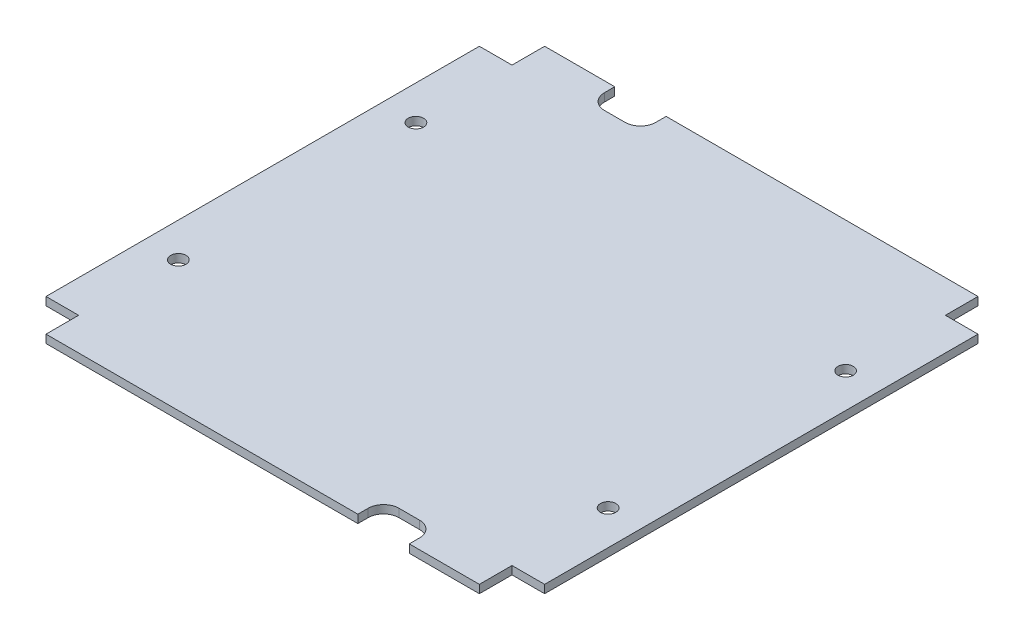
ISO-10303-21;
HEADER;
FILE_DESCRIPTION(('STEP AP214'),'2;1');
FILE_NAME('part.step','',(''),(''),'','','');
FILE_SCHEMA(('AUTOMOTIVE_DESIGN { 1 0 10303 214 1 1 1 1 }'));
ENDSEC;
DATA;
#1=APPLICATION_CONTEXT('core data for automotive mechanical design processes');
#2=APPLICATION_PROTOCOL_DEFINITION('international standard','automotive_design',2000,#1);
#3=PRODUCT_CONTEXT('',#1,'mechanical');
#4=PRODUCT('Part','Part','',(#3));
#5=PRODUCT_RELATED_PRODUCT_CATEGORY('part','',(#4));
#6=PRODUCT_DEFINITION_FORMATION('','',#4);
#7=PRODUCT_DEFINITION_CONTEXT('part definition',#1,'design');
#8=PRODUCT_DEFINITION('design','',#6,#7);
#9=PRODUCT_DEFINITION_SHAPE('','',#8);
#10=(LENGTH_UNIT() NAMED_UNIT(*) SI_UNIT(.MILLI.,.METRE.));
#11=(NAMED_UNIT(*) PLANE_ANGLE_UNIT() SI_UNIT($,.RADIAN.));
#12=(NAMED_UNIT(*) SI_UNIT($,.STERADIAN.) SOLID_ANGLE_UNIT());
#13=UNCERTAINTY_MEASURE_WITH_UNIT(LENGTH_MEASURE(1.E-05),#10,'distance_accuracy_value','');
#14=(GEOMETRIC_REPRESENTATION_CONTEXT(3) GLOBAL_UNCERTAINTY_ASSIGNED_CONTEXT((#13)) GLOBAL_UNIT_ASSIGNED_CONTEXT((#10,
#11,#12)) REPRESENTATION_CONTEXT('',''));
#15=CARTESIAN_POINT('',(0.,0.,0.));
#16=DIRECTION('',(0.,0.,1.));
#17=DIRECTION('',(1.,0.,0.));
#18=AXIS2_PLACEMENT_3D('',#15,#16,#17);
#19=CARTESIAN_POINT('',(61.8568578983799,34.525,-77.8015837190426));
#20=DIRECTION('',(0.,-1.,0.));
#21=DIRECTION('',(0.,0.,-1.));
#22=AXIS2_PLACEMENT_3D('',#19,#20,#21);
#23=PLANE('',#22);
#24=CARTESIAN_POINT('',(20.0443578983793,34.525,-100.914083719042));
#25=DIRECTION('',(0.,-1.,0.));
#26=DIRECTION('',(0.,0.,-1.));
#27=AXIS2_PLACEMENT_3D('',#24,#25,#26);
#28=CIRCLE('',#27,1.5);
#29=CARTESIAN_POINT('',(20.0443578983793,34.525,-102.414083719042));
#30=VERTEX_POINT('',#29);
#31=EDGE_CURVE('E167',#30,#30,#28,.F.);
#32=ORIENTED_EDGE('',*,*,#31,.T.);
#33=EDGE_LOOP('',(#32));
#34=FACE_BOUND('',#33,.T.);
#35=CARTESIAN_POINT('',(20.0443578983793,34.525,-54.6890837190416));
#36=DIRECTION('',(0.,-1.,0.));
#37=DIRECTION('',(0.,0.,-1.));
#38=AXIS2_PLACEMENT_3D('',#35,#36,#37);
#39=CIRCLE('',#38,1.5);
#40=CARTESIAN_POINT('',(20.0443578983793,34.525,-56.1890837190416));
#41=VERTEX_POINT('',#40);
#42=EDGE_CURVE('E170',#41,#41,#39,.F.);
#43=ORIENTED_EDGE('',*,*,#42,.T.);
#44=EDGE_LOOP('',(#43));
#45=FACE_BOUND('',#44,.T.);
#46=CARTESIAN_POINT('',(103.66935789838,34.525,-100.914083719043));
#47=DIRECTION('',(0.,-1.,0.));
#48=DIRECTION('',(0.,0.,-1.));
#49=AXIS2_PLACEMENT_3D('',#46,#47,#48);
#50=CIRCLE('',#49,1.5);
#51=CARTESIAN_POINT('',(103.66935789838,34.525,-102.414083719043));
#52=VERTEX_POINT('',#51);
#53=EDGE_CURVE('E446',#52,#52,#50,.F.);
#54=ORIENTED_EDGE('',*,*,#53,.T.);
#55=EDGE_LOOP('',(#54));
#56=FACE_BOUND('',#55,.T.);
#57=CARTESIAN_POINT('',(103.66935789838,34.525,-54.6890837190426));
#58=DIRECTION('',(0.,-1.,0.));
#59=DIRECTION('',(0.,0.,-1.));
#60=AXIS2_PLACEMENT_3D('',#57,#58,#59);
#61=CIRCLE('',#60,1.5);
#62=CARTESIAN_POINT('',(103.66935789838,34.525,-56.1890837190426));
#63=VERTEX_POINT('',#62);
#64=EDGE_CURVE('E179',#63,#63,#61,.F.);
#65=ORIENTED_EDGE('',*,*,#64,.T.);
#66=EDGE_LOOP('',(#65));
#67=FACE_BOUND('',#66,.T.);
#68=DIRECTION('',(0.,0.,1.));
#69=VECTOR('',#68,1.);
#70=CARTESIAN_POINT('',(19.6943578983799,34.525,-126.314083719043));
#71=LINE('',#70,#69);
#72=CARTESIAN_POINT('',(19.6943578983799,34.525,-126.314083719043));
#73=VERTEX_POINT('',#72);
#74=CARTESIAN_POINT('',(19.6943578983799,34.525,-119.964083719043));
#75=VERTEX_POINT('',#74);
#76=EDGE_CURVE('E349',#73,#75,#71,.T.);
#77=ORIENTED_EDGE('',*,*,#76,.F.);
#78=DIRECTION('',(-1.,0.,0.));
#79=VECTOR('',#78,1.);
#80=CARTESIAN_POINT('',(104.01935789838,34.525,-126.314083719043));
#81=LINE('',#80,#79);
#82=CARTESIAN_POINT('',(33.336683869696,34.525,-126.314083719043));
#83=VERTEX_POINT('',#82);
#84=EDGE_CURVE('E151',#83,#73,#81,.T.);
#85=ORIENTED_EDGE('',*,*,#84,.F.);
#86=DIRECTION('',(0.,0.,1.));
#87=VECTOR('',#86,1.);
#88=CARTESIAN_POINT('',(33.336683869696,34.525,-121.314083719043));
#89=LINE('',#88,#87);
#90=CARTESIAN_POINT('',(33.336683869696,34.525,-124.314083719043));
#91=VERTEX_POINT('',#90);
#92=EDGE_CURVE('E147',#83,#91,#89,.T.);
#93=ORIENTED_EDGE('',*,*,#92,.T.);
#94=CARTESIAN_POINT('',(36.336683869696,34.525,-124.314083719043));
#95=DIRECTION('',(0.,-1.,0.));
#96=DIRECTION('',(0.,0.,-1.));
#97=AXIS2_PLACEMENT_3D('',#94,#95,#96);
#98=CIRCLE('',#97,3.);
#99=CARTESIAN_POINT('',(36.336683869696,34.525,-121.314083719043));
#100=VERTEX_POINT('',#99);
#101=EDGE_CURVE('E180',#91,#100,#98,.F.);
#102=ORIENTED_EDGE('',*,*,#101,.T.);
#103=DIRECTION('',(1.,0.,0.));
#104=VECTOR('',#103,1.);
#105=CARTESIAN_POINT('',(43.336683869696,34.525,-121.314083719043));
#106=LINE('',#105,#104);
#107=CARTESIAN_POINT('',(40.336683869696,34.525,-121.314083719043));
#108=VERTEX_POINT('',#107);
#109=EDGE_CURVE('E185',#100,#108,#106,.T.);
#110=ORIENTED_EDGE('',*,*,#109,.T.);
#111=CARTESIAN_POINT('',(40.336683869696,34.525,-124.314083719043));
#112=DIRECTION('',(0.,-1.,0.));
#113=DIRECTION('',(0.,0.,-1.));
#114=AXIS2_PLACEMENT_3D('',#111,#112,#113);
#115=CIRCLE('',#114,3.);
#116=CARTESIAN_POINT('',(43.336683869696,34.525,-124.314083719043));
#117=VERTEX_POINT('',#116);
#118=EDGE_CURVE('E188',#108,#117,#115,.F.);
#119=ORIENTED_EDGE('',*,*,#118,.T.);
#120=DIRECTION('',(0.,0.,-1.));
#121=VECTOR('',#120,1.);
#122=CARTESIAN_POINT('',(43.336683869696,34.525,-126.314083719043));
#123=LINE('',#122,#121);
#124=CARTESIAN_POINT('',(43.336683869696,34.525,-126.314083719043));
#125=VERTEX_POINT('',#124);
#126=EDGE_CURVE('E192',#117,#125,#123,.T.);
#127=ORIENTED_EDGE('',*,*,#126,.T.);
#128=DIRECTION('',(-1.,0.,0.));
#129=VECTOR('',#128,1.);
#130=CARTESIAN_POINT('',(104.01935789838,34.525,-126.314083719043));
#131=LINE('',#130,#129);
#132=CARTESIAN_POINT('',(104.01935789838,34.525,-126.314083719043));
#133=VERTEX_POINT('',#132);
#134=EDGE_CURVE('E205',#133,#125,#131,.T.);
#135=ORIENTED_EDGE('',*,*,#134,.F.);
#136=DIRECTION('',(0.,0.,-1.));
#137=VECTOR('',#136,1.);
#138=CARTESIAN_POINT('',(104.01935789838,34.525,-119.964083719043));
#139=LINE('',#138,#137);
#140=CARTESIAN_POINT('',(104.01935789838,34.525,-119.964083719043));
#141=VERTEX_POINT('',#140);
#142=EDGE_CURVE('E216',#141,#133,#139,.T.);
#143=ORIENTED_EDGE('',*,*,#142,.F.);
#144=DIRECTION('',(-1.,0.,0.));
#145=VECTOR('',#144,1.);
#146=CARTESIAN_POINT('',(110.36935789838,34.525,-119.964083719043));
#147=LINE('',#146,#145);
#148=CARTESIAN_POINT('',(110.36935789838,34.525,-119.964083719043));
#149=VERTEX_POINT('',#148);
#150=EDGE_CURVE('E227',#149,#141,#147,.T.);
#151=ORIENTED_EDGE('',*,*,#150,.F.);
#152=DIRECTION('',(0.,0.,-1.));
#153=VECTOR('',#152,1.);
#154=CARTESIAN_POINT('',(110.36935789838,34.525,-35.6390837190426));
#155=LINE('',#154,#153);
#156=CARTESIAN_POINT('',(110.36935789838,34.525,-35.6390837190426));
#157=VERTEX_POINT('',#156);
#158=EDGE_CURVE('E238',#157,#149,#155,.T.);
#159=ORIENTED_EDGE('',*,*,#158,.F.);
#160=DIRECTION('',(1.,0.,0.));
#161=VECTOR('',#160,1.);
#162=CARTESIAN_POINT('',(104.01935789838,34.525,-35.6390837190426));
#163=LINE('',#162,#161);
#164=CARTESIAN_POINT('',(104.01935789838,34.525,-35.6390837190426));
#165=VERTEX_POINT('',#164);
#166=EDGE_CURVE('E249',#165,#157,#163,.T.);
#167=ORIENTED_EDGE('',*,*,#166,.F.);
#168=DIRECTION('',(0.,0.,-1.));
#169=VECTOR('',#168,1.);
#170=CARTESIAN_POINT('',(104.01935789838,34.525,-29.2890837190426));
#171=LINE('',#170,#169);
#172=CARTESIAN_POINT('',(104.01935789838,34.525,-29.2890837190426));
#173=VERTEX_POINT('',#172);
#174=EDGE_CURVE('E260',#173,#165,#171,.T.);
#175=ORIENTED_EDGE('',*,*,#174,.F.);
#176=DIRECTION('',(1.,0.,0.));
#177=VECTOR('',#176,1.);
#178=CARTESIAN_POINT('',(19.6943578983799,34.525,-29.2890837190426));
#179=LINE('',#178,#177);
#180=CARTESIAN_POINT('',(90.3770319270637,34.525,-29.2890837190426));
#181=VERTEX_POINT('',#180);
#182=EDGE_CURVE('E271',#181,#173,#179,.T.);
#183=ORIENTED_EDGE('',*,*,#182,.F.);
#184=DIRECTION('',(0.,0.,-1.));
#185=VECTOR('',#184,1.);
#186=CARTESIAN_POINT('',(90.3770319270637,34.525,-34.2890837190425));
#187=LINE('',#186,#185);
#188=CARTESIAN_POINT('',(90.3770319270637,34.525,-31.2890837190425));
#189=VERTEX_POINT('',#188);
#190=EDGE_CURVE('E276',#181,#189,#187,.T.);
#191=ORIENTED_EDGE('',*,*,#190,.T.);
#192=CARTESIAN_POINT('',(87.3770319270637,34.525,-31.2890837190425));
#193=DIRECTION('',(0.,-1.,0.));
#194=DIRECTION('',(0.,0.,-1.));
#195=AXIS2_PLACEMENT_3D('',#192,#193,#194);
#196=CIRCLE('',#195,3.);
#197=CARTESIAN_POINT('',(87.3770319270637,34.525,-34.2890837190425));
#198=VERTEX_POINT('',#197);
#199=EDGE_CURVE('E279',#189,#198,#196,.F.);
#200=ORIENTED_EDGE('',*,*,#199,.T.);
#201=DIRECTION('',(-1.,0.,0.));
#202=VECTOR('',#201,1.);
#203=CARTESIAN_POINT('',(80.3770319270637,34.525,-34.2890837190425));
#204=LINE('',#203,#202);
#205=CARTESIAN_POINT('',(83.3770319270637,34.525,-34.2890837190425));
#206=VERTEX_POINT('',#205);
#207=EDGE_CURVE('E89',#198,#206,#204,.T.);
#208=ORIENTED_EDGE('',*,*,#207,.T.);
#209=CARTESIAN_POINT('',(83.3770319270637,34.525,-31.2890837190425));
#210=DIRECTION('',(0.,-1.,0.));
#211=DIRECTION('',(0.,0.,-1.));
#212=AXIS2_PLACEMENT_3D('',#209,#210,#211);
#213=CIRCLE('',#212,3.);
#214=CARTESIAN_POINT('',(80.3770319270637,34.525,-31.2890837190425));
#215=VERTEX_POINT('',#214);
#216=EDGE_CURVE('E20',#206,#215,#213,.F.);
#217=ORIENTED_EDGE('',*,*,#216,.T.);
#218=DIRECTION('',(0.,0.,1.));
#219=VECTOR('',#218,1.);
#220=CARTESIAN_POINT('',(80.3770319270637,34.525,-29.2890837190425));
#221=LINE('',#220,#219);
#222=CARTESIAN_POINT('',(80.3770319270637,34.525,-29.2890837190426));
#223=VERTEX_POINT('',#222);
#224=EDGE_CURVE('E97',#215,#223,#221,.T.);
#225=ORIENTED_EDGE('',*,*,#224,.T.);
#226=DIRECTION('',(1.,0.,0.));
#227=VECTOR('',#226,1.);
#228=CARTESIAN_POINT('',(19.6943578983799,34.525,-29.2890837190426));
#229=LINE('',#228,#227);
#230=CARTESIAN_POINT('',(19.6943578983799,34.525,-29.2890837190426));
#231=VERTEX_POINT('',#230);
#232=EDGE_CURVE('E299',#231,#223,#229,.T.);
#233=ORIENTED_EDGE('',*,*,#232,.F.);
#234=DIRECTION('',(0.,0.,1.));
#235=VECTOR('',#234,1.);
#236=CARTESIAN_POINT('',(19.6943578983799,34.525,-35.6390837190426));
#237=LINE('',#236,#235);
#238=CARTESIAN_POINT('',(19.6943578983799,34.525,-35.6390837190426));
#239=VERTEX_POINT('',#238);
#240=EDGE_CURVE('E310',#239,#231,#237,.T.);
#241=ORIENTED_EDGE('',*,*,#240,.F.);
#242=DIRECTION('',(1.,0.,0.));
#243=VECTOR('',#242,1.);
#244=CARTESIAN_POINT('',(13.3443578983799,34.525,-35.6390837190426));
#245=LINE('',#244,#243);
#246=CARTESIAN_POINT('',(13.3443578983799,34.525,-35.6390837190426));
#247=VERTEX_POINT('',#246);
#248=EDGE_CURVE('E321',#247,#239,#245,.T.);
#249=ORIENTED_EDGE('',*,*,#248,.F.);
#250=DIRECTION('',(0.,0.,1.));
#251=VECTOR('',#250,1.);
#252=CARTESIAN_POINT('',(13.3443578983799,34.525,-119.964083719043));
#253=LINE('',#252,#251);
#254=CARTESIAN_POINT('',(13.3443578983799,34.525,-119.964083719043));
#255=VERTEX_POINT('',#254);
#256=EDGE_CURVE('E332',#255,#247,#253,.T.);
#257=ORIENTED_EDGE('',*,*,#256,.F.);
#258=DIRECTION('',(-1.,0.,0.));
#259=VECTOR('',#258,1.);
#260=CARTESIAN_POINT('',(19.6943578983799,34.525,-119.964083719043));
#261=LINE('',#260,#259);
#262=EDGE_CURVE('E342',#75,#255,#261,.T.);
#263=ORIENTED_EDGE('',*,*,#262,.F.);
#264=EDGE_LOOP('',(#77,#85,#93,#102,#110,#119,#127,#135,#143,#151,#159,#167,#175,#183,#191,#200,
#208,#217,#225,#233,#241,#249,#257,#263));
#265=FACE_BOUND('',#264,.T.);
#266=ADVANCED_FACE('F17',(#34,#45,#56,#67,#265),#23,.T.);
#267=CARTESIAN_POINT('',(33.336683869696,36.113,-121.314083719043));
#268=DIRECTION('',(-1.,0.,0.));
#269=DIRECTION('',(0.,0.,1.));
#270=AXIS2_PLACEMENT_3D('',#267,#268,#269);
#271=PLANE('',#270);
#272=ORIENTED_EDGE('',*,*,#92,.F.);
#273=DIRECTION('',(0.,1.,0.));
#274=VECTOR('',#273,1.);
#275=CARTESIAN_POINT('',(33.336683869696,34.525,-126.314083719043));
#276=LINE('',#275,#274);
#277=CARTESIAN_POINT('',(33.3366838696961,36.113,-126.314083719043));
#278=VERTEX_POINT('',#277);
#279=EDGE_CURVE('E140',#278,#83,#276,.F.);
#280=ORIENTED_EDGE('',*,*,#279,.F.);
#281=DIRECTION('',(0.,0.,1.));
#282=VECTOR('',#281,1.);
#283=CARTESIAN_POINT('',(33.3366838696961,36.113,-77.8015837190426));
#284=LINE('',#283,#282);
#285=CARTESIAN_POINT('',(33.3366838696961,36.113,-124.314083719043));
#286=VERTEX_POINT('',#285);
#287=EDGE_CURVE('E145',#286,#278,#284,.F.);
#288=ORIENTED_EDGE('',*,*,#287,.F.);
#289=DIRECTION('',(0.,-1.,0.));
#290=VECTOR('',#289,1.);
#291=CARTESIAN_POINT('',(33.336683869696,36.113,-124.314083719043));
#292=LINE('',#291,#290);
#293=EDGE_CURVE('E181',#286,#91,#292,.T.);
#294=ORIENTED_EDGE('',*,*,#293,.T.);
#295=EDGE_LOOP('',(#272,#280,#288,#294));
#296=FACE_BOUND('',#295,.T.);
#297=ADVANCED_FACE('F142',(#296),#271,.F.);
#298=CARTESIAN_POINT('',(104.01935789838,34.525,-126.314083719043));
#299=DIRECTION('',(0.,0.,-1.));
#300=DIRECTION('',(-1.,0.,0.));
#301=AXIS2_PLACEMENT_3D('',#298,#299,#300);
#302=PLANE('',#301);
#303=DIRECTION('',(0.,1.,0.));
#304=VECTOR('',#303,1.);
#305=CARTESIAN_POINT('',(19.6943578983799,34.525,-126.314083719043));
#306=LINE('',#305,#304);
#307=CARTESIAN_POINT('',(19.6943578983799,36.113,-126.314083719043));
#308=VERTEX_POINT('',#307);
#309=EDGE_CURVE('E157',#308,#73,#306,.F.);
#310=ORIENTED_EDGE('',*,*,#309,.F.);
#311=DIRECTION('',(1.,0.,0.));
#312=VECTOR('',#311,1.);
#313=CARTESIAN_POINT('',(61.8568578983799,36.113,-126.314083719043));
#314=LINE('',#313,#312);
#315=EDGE_CURVE('E154',#278,#308,#314,.F.);
#316=ORIENTED_EDGE('',*,*,#315,.F.);
#317=ORIENTED_EDGE('',*,*,#279,.T.);
#318=ORIENTED_EDGE('',*,*,#84,.T.);
#319=EDGE_LOOP('',(#310,#316,#317,#318));
#320=FACE_BOUND('',#319,.T.);
#321=ADVANCED_FACE('F155',(#320),#302,.T.);
#322=CARTESIAN_POINT('',(19.6943578983799,34.525,-126.314083719043));
#323=DIRECTION('',(-1.,0.,0.));
#324=DIRECTION('',(0.,0.,1.));
#325=AXIS2_PLACEMENT_3D('',#322,#323,#324);
#326=PLANE('',#325);
#327=DIRECTION('',(0.,0.,1.));
#328=VECTOR('',#327,1.);
#329=CARTESIAN_POINT('',(19.6943578983799,36.113,-77.8015837190426));
#330=LINE('',#329,#328);
#331=CARTESIAN_POINT('',(19.6943578983799,36.113,-119.964083719043));
#332=VERTEX_POINT('',#331);
#333=EDGE_CURVE('E161',#308,#332,#330,.T.);
#334=ORIENTED_EDGE('',*,*,#333,.F.);
#335=ORIENTED_EDGE('',*,*,#309,.T.);
#336=ORIENTED_EDGE('',*,*,#76,.T.);
#337=DIRECTION('',(0.,1.,0.));
#338=VECTOR('',#337,1.);
#339=CARTESIAN_POINT('',(19.6943578983799,34.525,-119.964083719043));
#340=LINE('',#339,#338);
#341=EDGE_CURVE('E339',#332,#75,#340,.F.);
#342=ORIENTED_EDGE('',*,*,#341,.F.);
#343=EDGE_LOOP('',(#334,#335,#336,#342));
#344=FACE_BOUND('',#343,.T.);
#345=ADVANCED_FACE('F494',(#344),#326,.T.);
#346=CARTESIAN_POINT('',(19.6943578983799,34.525,-119.964083719043));
#347=DIRECTION('',(0.,0.,-1.));
#348=DIRECTION('',(-1.,0.,0.));
#349=AXIS2_PLACEMENT_3D('',#346,#347,#348);
#350=PLANE('',#349);
#351=DIRECTION('',(1.,0.,0.));
#352=VECTOR('',#351,1.);
#353=CARTESIAN_POINT('',(61.8568578983799,36.113,-119.964083719043));
#354=LINE('',#353,#352);
#355=CARTESIAN_POINT('',(13.3443578983799,36.113,-119.964083719043));
#356=VERTEX_POINT('',#355);
#357=EDGE_CURVE('E326',#332,#356,#354,.F.);
#358=ORIENTED_EDGE('',*,*,#357,.F.);
#359=ORIENTED_EDGE('',*,*,#341,.T.);
#360=ORIENTED_EDGE('',*,*,#262,.T.);
#361=DIRECTION('',(0.,1.,0.));
#362=VECTOR('',#361,1.);
#363=CARTESIAN_POINT('',(13.3443578983799,34.525,-119.964083719043));
#364=LINE('',#363,#362);
#365=EDGE_CURVE('E329',#356,#255,#364,.F.);
#366=ORIENTED_EDGE('',*,*,#365,.F.);
#367=EDGE_LOOP('',(#358,#359,#360,#366));
#368=FACE_BOUND('',#367,.T.);
#369=ADVANCED_FACE('F492',(#368),#350,.T.);
#370=CARTESIAN_POINT('',(13.3443578983799,34.525,-119.964083719043));
#371=DIRECTION('',(-1.,0.,0.));
#372=DIRECTION('',(0.,0.,1.));
#373=AXIS2_PLACEMENT_3D('',#370,#371,#372);
#374=PLANE('',#373);
#375=DIRECTION('',(0.,0.,1.));
#376=VECTOR('',#375,1.);
#377=CARTESIAN_POINT('',(13.3443578983799,36.113,-77.8015837190426));
#378=LINE('',#377,#376);
#379=CARTESIAN_POINT('',(13.3443578983799,36.113,-35.6390837190426));
#380=VERTEX_POINT('',#379);
#381=EDGE_CURVE('E315',#356,#380,#378,.T.);
#382=ORIENTED_EDGE('',*,*,#381,.F.);
#383=ORIENTED_EDGE('',*,*,#365,.T.);
#384=ORIENTED_EDGE('',*,*,#256,.T.);
#385=DIRECTION('',(0.,1.,0.));
#386=VECTOR('',#385,1.);
#387=CARTESIAN_POINT('',(13.3443578983799,34.525,-35.6390837190426));
#388=LINE('',#387,#386);
#389=EDGE_CURVE('E318',#380,#247,#388,.F.);
#390=ORIENTED_EDGE('',*,*,#389,.F.);
#391=EDGE_LOOP('',(#382,#383,#384,#390));
#392=FACE_BOUND('',#391,.T.);
#393=ADVANCED_FACE('F490',(#392),#374,.T.);
#394=CARTESIAN_POINT('',(13.3443578983799,34.525,-35.6390837190426));
#395=DIRECTION('',(0.,0.,1.));
#396=DIRECTION('',(1.,0.,0.));
#397=AXIS2_PLACEMENT_3D('',#394,#395,#396);
#398=PLANE('',#397);
#399=DIRECTION('',(1.,0.,0.));
#400=VECTOR('',#399,1.);
#401=CARTESIAN_POINT('',(61.8568578983799,36.113,-35.6390837190426));
#402=LINE('',#401,#400);
#403=CARTESIAN_POINT('',(19.6943578983799,36.113,-35.6390837190426));
#404=VERTEX_POINT('',#403);
#405=EDGE_CURVE('E305',#380,#404,#402,.T.);
#406=ORIENTED_EDGE('',*,*,#405,.F.);
#407=ORIENTED_EDGE('',*,*,#389,.T.);
#408=ORIENTED_EDGE('',*,*,#248,.T.);
#409=DIRECTION('',(0.,1.,0.));
#410=VECTOR('',#409,1.);
#411=CARTESIAN_POINT('',(19.6943578983799,34.525,-35.6390837190426));
#412=LINE('',#411,#410);
#413=EDGE_CURVE('E300',#404,#239,#412,.F.);
#414=ORIENTED_EDGE('',*,*,#413,.F.);
#415=EDGE_LOOP('',(#406,#407,#408,#414));
#416=FACE_BOUND('',#415,.T.);
#417=ADVANCED_FACE('F484',(#416),#398,.T.);
#418=CARTESIAN_POINT('',(19.6943578983799,34.525,-35.6390837190426));
#419=DIRECTION('',(-1.,0.,0.));
#420=DIRECTION('',(0.,0.,1.));
#421=AXIS2_PLACEMENT_3D('',#418,#419,#420);
#422=PLANE('',#421);
#423=DIRECTION('',(0.,0.,1.));
#424=VECTOR('',#423,1.);
#425=CARTESIAN_POINT('',(19.6943578983799,36.113,-77.8015837190426));
#426=LINE('',#425,#424);
#427=CARTESIAN_POINT('',(19.6943578983799,36.113,-29.2890837190426));
#428=VERTEX_POINT('',#427);
#429=EDGE_CURVE('E293',#404,#428,#426,.T.);
#430=ORIENTED_EDGE('',*,*,#429,.F.);
#431=ORIENTED_EDGE('',*,*,#413,.T.);
#432=ORIENTED_EDGE('',*,*,#240,.T.);
#433=DIRECTION('',(0.,1.,0.));
#434=VECTOR('',#433,1.);
#435=CARTESIAN_POINT('',(19.6943578983799,34.525,-29.2890837190426));
#436=LINE('',#435,#434);
#437=EDGE_CURVE('E296',#428,#231,#436,.F.);
#438=ORIENTED_EDGE('',*,*,#437,.F.);
#439=EDGE_LOOP('',(#430,#431,#432,#438));
#440=FACE_BOUND('',#439,.T.);
#441=ADVANCED_FACE('F486',(#440),#422,.T.);
#442=CARTESIAN_POINT('',(19.6943578983799,34.525,-29.2890837190426));
#443=DIRECTION('',(0.,0.,1.));
#444=DIRECTION('',(1.,0.,0.));
#445=AXIS2_PLACEMENT_3D('',#442,#443,#444);
#446=PLANE('',#445);
#447=ORIENTED_EDGE('',*,*,#437,.T.);
#448=ORIENTED_EDGE('',*,*,#232,.T.);
#449=DIRECTION('',(0.,1.,0.));
#450=VECTOR('',#449,1.);
#451=CARTESIAN_POINT('',(80.3770319270637,36.113,-29.2890837190426));
#452=LINE('',#451,#450);
#453=CARTESIAN_POINT('',(80.3770319270637,36.113,-29.2890837190426));
#454=VERTEX_POINT('',#453);
#455=EDGE_CURVE('E284',#223,#454,#452,.T.);
#456=ORIENTED_EDGE('',*,*,#455,.T.);
#457=DIRECTION('',(1.,0.,0.));
#458=VECTOR('',#457,1.);
#459=CARTESIAN_POINT('',(61.8568578983799,36.113,-29.2890837190426));
#460=LINE('',#459,#458);
#461=EDGE_CURVE('E289',#428,#454,#460,.T.);
#462=ORIENTED_EDGE('',*,*,#461,.F.);
#463=EDGE_LOOP('',(#447,#448,#456,#462));
#464=FACE_BOUND('',#463,.T.);
#465=ADVANCED_FACE('F480',(#464),#446,.T.);
#466=CARTESIAN_POINT('',(80.3770319270637,36.113,-29.2890837190425));
#467=DIRECTION('',(-1.,0.,0.));
#468=DIRECTION('',(0.,0.,1.));
#469=AXIS2_PLACEMENT_3D('',#466,#467,#468);
#470=PLANE('',#469);
#471=DIRECTION('',(0.,0.,1.));
#472=VECTOR('',#471,1.);
#473=CARTESIAN_POINT('',(80.3770319270637,36.113,-77.8015837190426));
#474=LINE('',#473,#472);
#475=CARTESIAN_POINT('',(80.3770319270637,36.113,-31.2890837190425));
#476=VERTEX_POINT('',#475);
#477=EDGE_CURVE('E292',#454,#476,#474,.F.);
#478=ORIENTED_EDGE('',*,*,#477,.F.);
#479=ORIENTED_EDGE('',*,*,#455,.F.);
#480=ORIENTED_EDGE('',*,*,#224,.F.);
#481=DIRECTION('',(0.,-1.,0.));
#482=VECTOR('',#481,1.);
#483=CARTESIAN_POINT('',(80.3770319270637,36.113,-31.2890837190425));
#484=LINE('',#483,#482);
#485=EDGE_CURVE('E282',#215,#476,#484,.F.);
#486=ORIENTED_EDGE('',*,*,#485,.T.);
#487=EDGE_LOOP('',(#478,#479,#480,#486));
#488=FACE_BOUND('',#487,.T.);
#489=ADVANCED_FACE('F477',(#488),#470,.F.);
#490=CARTESIAN_POINT('',(83.3770319270637,36.113,-31.2890837190425));
#491=DIRECTION('',(0.,-1.,0.));
#492=DIRECTION('',(0.,0.,-1.));
#493=AXIS2_PLACEMENT_3D('',#490,#491,#492);
#494=CYLINDRICAL_SURFACE('',#493,3.);
#495=ORIENTED_EDGE('',*,*,#485,.F.);
#496=ORIENTED_EDGE('',*,*,#216,.F.);
#497=DIRECTION('',(0.,1.,0.));
#498=VECTOR('',#497,1.);
#499=CARTESIAN_POINT('',(83.3770319270637,36.113,-34.2890837190425));
#500=LINE('',#499,#498);
#501=CARTESIAN_POINT('',(83.3770319270637,36.113,-34.2890837190426));
#502=VERTEX_POINT('',#501);
#503=EDGE_CURVE('E280',#206,#502,#500,.T.);
#504=ORIENTED_EDGE('',*,*,#503,.T.);
#505=CARTESIAN_POINT('',(83.3770319270637,36.113,-31.2890837190425));
#506=DIRECTION('',(0.,-1.,0.));
#507=DIRECTION('',(0.,0.,-1.));
#508=AXIS2_PLACEMENT_3D('',#505,#506,#507);
#509=CIRCLE('',#508,3.);
#510=EDGE_CURVE('E441',#476,#502,#509,.T.);
#511=ORIENTED_EDGE('',*,*,#510,.F.);
#512=EDGE_LOOP('',(#495,#496,#504,#511));
#513=FACE_BOUND('',#512,.T.);
#514=ADVANCED_FACE('F647',(#513),#494,.F.);
#515=CARTESIAN_POINT('',(80.3770319270637,36.113,-34.2890837190425));
#516=DIRECTION('',(0.,0.,-1.));
#517=DIRECTION('',(-1.,0.,0.));
#518=AXIS2_PLACEMENT_3D('',#515,#516,#517);
#519=PLANE('',#518);
#520=DIRECTION('',(1.,0.,0.));
#521=VECTOR('',#520,1.);
#522=CARTESIAN_POINT('',(61.8568578983799,36.113,-34.2890837190426));
#523=LINE('',#522,#521);
#524=CARTESIAN_POINT('',(87.3770319270637,36.113,-34.2890837190426));
#525=VERTEX_POINT('',#524);
#526=EDGE_CURVE('E440',#502,#525,#523,.T.);
#527=ORIENTED_EDGE('',*,*,#526,.F.);
#528=ORIENTED_EDGE('',*,*,#503,.F.);
#529=ORIENTED_EDGE('',*,*,#207,.F.);
#530=DIRECTION('',(0.,-1.,0.));
#531=VECTOR('',#530,1.);
#532=CARTESIAN_POINT('',(87.3770319270637,36.113,-34.2890837190425));
#533=LINE('',#532,#531);
#534=EDGE_CURVE('E277',#198,#525,#533,.F.);
#535=ORIENTED_EDGE('',*,*,#534,.T.);
#536=EDGE_LOOP('',(#527,#528,#529,#535));
#537=FACE_BOUND('',#536,.T.);
#538=ADVANCED_FACE('F461',(#537),#519,.F.);
#539=CARTESIAN_POINT('',(87.3770319270637,36.113,-31.2890837190425));
#540=DIRECTION('',(0.,-1.,0.));
#541=DIRECTION('',(0.,0.,-1.));
#542=AXIS2_PLACEMENT_3D('',#539,#540,#541);
#543=CYLINDRICAL_SURFACE('',#542,3.);
#544=ORIENTED_EDGE('',*,*,#534,.F.);
#545=ORIENTED_EDGE('',*,*,#199,.F.);
#546=DIRECTION('',(0.,1.,0.));
#547=VECTOR('',#546,1.);
#548=CARTESIAN_POINT('',(90.3770319270637,36.113,-31.2890837190425));
#549=LINE('',#548,#547);
#550=CARTESIAN_POINT('',(90.3770319270637,36.113,-31.2890837190425));
#551=VERTEX_POINT('',#550);
#552=EDGE_CURVE('E272',#189,#551,#549,.T.);
#553=ORIENTED_EDGE('',*,*,#552,.T.);
#554=CARTESIAN_POINT('',(87.3770319270637,36.113,-31.2890837190425));
#555=DIRECTION('',(0.,-1.,0.));
#556=DIRECTION('',(0.,0.,-1.));
#557=AXIS2_PLACEMENT_3D('',#554,#555,#556);
#558=CIRCLE('',#557,3.);
#559=EDGE_CURVE('E437',#525,#551,#558,.T.);
#560=ORIENTED_EDGE('',*,*,#559,.F.);
#561=EDGE_LOOP('',(#544,#545,#553,#560));
#562=FACE_BOUND('',#561,.T.);
#563=ADVANCED_FACE('F463',(#562),#543,.F.);
#564=CARTESIAN_POINT('',(90.3770319270637,36.113,-34.2890837190425));
#565=DIRECTION('',(1.,0.,0.));
#566=DIRECTION('',(0.,0.,-1.));
#567=AXIS2_PLACEMENT_3D('',#564,#565,#566);
#568=PLANE('',#567);
#569=ORIENTED_EDGE('',*,*,#190,.F.);
#570=DIRECTION('',(0.,1.,0.));
#571=VECTOR('',#570,1.);
#572=CARTESIAN_POINT('',(90.3770319270637,34.525,-29.2890837190426));
#573=LINE('',#572,#571);
#574=CARTESIAN_POINT('',(90.3770319270637,36.113,-29.2890837190425));
#575=VERTEX_POINT('',#574);
#576=EDGE_CURVE('E268',#575,#181,#573,.F.);
#577=ORIENTED_EDGE('',*,*,#576,.F.);
#578=DIRECTION('',(0.,0.,1.));
#579=VECTOR('',#578,1.);
#580=CARTESIAN_POINT('',(90.3770319270637,36.113,-77.8015837190426));
#581=LINE('',#580,#579);
#582=EDGE_CURVE('E265',#551,#575,#581,.T.);
#583=ORIENTED_EDGE('',*,*,#582,.F.);
#584=ORIENTED_EDGE('',*,*,#552,.F.);
#585=EDGE_LOOP('',(#569,#577,#583,#584));
#586=FACE_BOUND('',#585,.T.);
#587=ADVANCED_FACE('F510',(#586),#568,.F.);
#588=CARTESIAN_POINT('',(19.6943578983799,34.525,-29.2890837190426));
#589=DIRECTION('',(0.,0.,1.));
#590=DIRECTION('',(1.,0.,0.));
#591=AXIS2_PLACEMENT_3D('',#588,#589,#590);
#592=PLANE('',#591);
#593=DIRECTION('',(0.,1.,0.));
#594=VECTOR('',#593,1.);
#595=CARTESIAN_POINT('',(104.01935789838,34.525,-29.2890837190426));
#596=LINE('',#595,#594);
#597=CARTESIAN_POINT('',(104.01935789838,36.113,-29.2890837190425));
#598=VERTEX_POINT('',#597);
#599=EDGE_CURVE('E257',#598,#173,#596,.F.);
#600=ORIENTED_EDGE('',*,*,#599,.F.);
#601=DIRECTION('',(1.,0.,0.));
#602=VECTOR('',#601,1.);
#603=CARTESIAN_POINT('',(61.8568578983799,36.113,-29.2890837190425));
#604=LINE('',#603,#602);
#605=EDGE_CURVE('E254',#575,#598,#604,.T.);
#606=ORIENTED_EDGE('',*,*,#605,.F.);
#607=ORIENTED_EDGE('',*,*,#576,.T.);
#608=ORIENTED_EDGE('',*,*,#182,.T.);
#609=EDGE_LOOP('',(#600,#606,#607,#608));
#610=FACE_BOUND('',#609,.T.);
#611=ADVANCED_FACE('F513',(#610),#592,.T.);
#612=CARTESIAN_POINT('',(104.01935789838,34.525,-29.2890837190426));
#613=DIRECTION('',(1.,0.,0.));
#614=DIRECTION('',(0.,0.,-1.));
#615=AXIS2_PLACEMENT_3D('',#612,#613,#614);
#616=PLANE('',#615);
#617=DIRECTION('',(0.,0.,1.));
#618=VECTOR('',#617,1.);
#619=CARTESIAN_POINT('',(104.01935789838,36.113,-77.8015837190426));
#620=LINE('',#619,#618);
#621=CARTESIAN_POINT('',(104.01935789838,36.113,-35.6390837190426));
#622=VERTEX_POINT('',#621);
#623=EDGE_CURVE('E243',#598,#622,#620,.F.);
#624=ORIENTED_EDGE('',*,*,#623,.F.);
#625=ORIENTED_EDGE('',*,*,#599,.T.);
#626=ORIENTED_EDGE('',*,*,#174,.T.);
#627=DIRECTION('',(0.,1.,0.));
#628=VECTOR('',#627,1.);
#629=CARTESIAN_POINT('',(104.01935789838,34.525,-35.6390837190426));
#630=LINE('',#629,#628);
#631=EDGE_CURVE('E246',#622,#165,#630,.F.);
#632=ORIENTED_EDGE('',*,*,#631,.F.);
#633=EDGE_LOOP('',(#624,#625,#626,#632));
#634=FACE_BOUND('',#633,.T.);
#635=ADVANCED_FACE('F520',(#634),#616,.T.);
#636=CARTESIAN_POINT('',(104.01935789838,34.525,-35.6390837190426));
#637=DIRECTION('',(0.,0.,1.));
#638=DIRECTION('',(1.,0.,0.));
#639=AXIS2_PLACEMENT_3D('',#636,#637,#638);
#640=PLANE('',#639);
#641=DIRECTION('',(1.,0.,0.));
#642=VECTOR('',#641,1.);
#643=CARTESIAN_POINT('',(61.8568578983799,36.113,-35.6390837190426));
#644=LINE('',#643,#642);
#645=CARTESIAN_POINT('',(110.36935789838,36.113,-35.6390837190426));
#646=VERTEX_POINT('',#645);
#647=EDGE_CURVE('E232',#622,#646,#644,.T.);
#648=ORIENTED_EDGE('',*,*,#647,.F.);
#649=ORIENTED_EDGE('',*,*,#631,.T.);
#650=ORIENTED_EDGE('',*,*,#166,.T.);
#651=DIRECTION('',(0.,1.,0.));
#652=VECTOR('',#651,1.);
#653=CARTESIAN_POINT('',(110.36935789838,34.525,-35.6390837190426));
#654=LINE('',#653,#652);
#655=EDGE_CURVE('E235',#646,#157,#654,.F.);
#656=ORIENTED_EDGE('',*,*,#655,.F.);
#657=EDGE_LOOP('',(#648,#649,#650,#656));
#658=FACE_BOUND('',#657,.T.);
#659=ADVANCED_FACE('F538',(#658),#640,.T.);
#660=CARTESIAN_POINT('',(110.36935789838,34.525,-35.6390837190426));
#661=DIRECTION('',(1.,0.,0.));
#662=DIRECTION('',(0.,0.,-1.));
#663=AXIS2_PLACEMENT_3D('',#660,#661,#662);
#664=PLANE('',#663);
#665=DIRECTION('',(0.,0.,1.));
#666=VECTOR('',#665,1.);
#667=CARTESIAN_POINT('',(110.36935789838,36.113,-77.8015837190426));
#668=LINE('',#667,#666);
#669=CARTESIAN_POINT('',(110.36935789838,36.113,-119.964083719043));
#670=VERTEX_POINT('',#669);
#671=EDGE_CURVE('E221',#646,#670,#668,.F.);
#672=ORIENTED_EDGE('',*,*,#671,.F.);
#673=ORIENTED_EDGE('',*,*,#655,.T.);
#674=ORIENTED_EDGE('',*,*,#158,.T.);
#675=DIRECTION('',(0.,1.,0.));
#676=VECTOR('',#675,1.);
#677=CARTESIAN_POINT('',(110.36935789838,34.525,-119.964083719043));
#678=LINE('',#677,#676);
#679=EDGE_CURVE('E224',#670,#149,#678,.F.);
#680=ORIENTED_EDGE('',*,*,#679,.F.);
#681=EDGE_LOOP('',(#672,#673,#674,#680));
#682=FACE_BOUND('',#681,.T.);
#683=ADVANCED_FACE('F542',(#682),#664,.T.);
#684=CARTESIAN_POINT('',(110.36935789838,34.525,-119.964083719043));
#685=DIRECTION('',(0.,0.,-1.));
#686=DIRECTION('',(-1.,0.,0.));
#687=AXIS2_PLACEMENT_3D('',#684,#685,#686);
#688=PLANE('',#687);
#689=DIRECTION('',(1.,0.,0.));
#690=VECTOR('',#689,1.);
#691=CARTESIAN_POINT('',(61.8568578983799,36.113,-119.964083719043));
#692=LINE('',#691,#690);
#693=CARTESIAN_POINT('',(104.01935789838,36.113,-119.964083719043));
#694=VERTEX_POINT('',#693);
#695=EDGE_CURVE('E211',#670,#694,#692,.F.);
#696=ORIENTED_EDGE('',*,*,#695,.F.);
#697=ORIENTED_EDGE('',*,*,#679,.T.);
#698=ORIENTED_EDGE('',*,*,#150,.T.);
#699=DIRECTION('',(0.,1.,0.));
#700=VECTOR('',#699,1.);
#701=CARTESIAN_POINT('',(104.01935789838,34.525,-119.964083719043));
#702=LINE('',#701,#700);
#703=EDGE_CURVE('E206',#694,#141,#702,.F.);
#704=ORIENTED_EDGE('',*,*,#703,.F.);
#705=EDGE_LOOP('',(#696,#697,#698,#704));
#706=FACE_BOUND('',#705,.T.);
#707=ADVANCED_FACE('F557',(#706),#688,.T.);
#708=CARTESIAN_POINT('',(104.01935789838,34.525,-119.964083719043));
#709=DIRECTION('',(1.,0.,0.));
#710=DIRECTION('',(0.,0.,-1.));
#711=AXIS2_PLACEMENT_3D('',#708,#709,#710);
#712=PLANE('',#711);
#713=DIRECTION('',(0.,0.,1.));
#714=VECTOR('',#713,1.);
#715=CARTESIAN_POINT('',(104.01935789838,36.113,-77.8015837190426));
#716=LINE('',#715,#714);
#717=CARTESIAN_POINT('',(104.01935789838,36.113,-126.314083719043));
#718=VERTEX_POINT('',#717);
#719=EDGE_CURVE('E199',#694,#718,#716,.F.);
#720=ORIENTED_EDGE('',*,*,#719,.F.);
#721=ORIENTED_EDGE('',*,*,#703,.T.);
#722=ORIENTED_EDGE('',*,*,#142,.T.);
#723=DIRECTION('',(0.,1.,0.));
#724=VECTOR('',#723,1.);
#725=CARTESIAN_POINT('',(104.01935789838,34.525,-126.314083719043));
#726=LINE('',#725,#724);
#727=EDGE_CURVE('E202',#718,#133,#726,.F.);
#728=ORIENTED_EDGE('',*,*,#727,.F.);
#729=EDGE_LOOP('',(#720,#721,#722,#728));
#730=FACE_BOUND('',#729,.T.);
#731=ADVANCED_FACE('F561',(#730),#712,.T.);
#732=CARTESIAN_POINT('',(104.01935789838,34.525,-126.314083719043));
#733=DIRECTION('',(0.,0.,-1.));
#734=DIRECTION('',(-1.,0.,0.));
#735=AXIS2_PLACEMENT_3D('',#732,#733,#734);
#736=PLANE('',#735);
#737=ORIENTED_EDGE('',*,*,#727,.T.);
#738=ORIENTED_EDGE('',*,*,#134,.T.);
#739=DIRECTION('',(0.,1.,0.));
#740=VECTOR('',#739,1.);
#741=CARTESIAN_POINT('',(43.336683869696,36.113,-126.314083719043));
#742=LINE('',#741,#740);
#743=CARTESIAN_POINT('',(43.336683869696,36.113,-126.314083719043));
#744=VERTEX_POINT('',#743);
#745=EDGE_CURVE('E189',#125,#744,#742,.T.);
#746=ORIENTED_EDGE('',*,*,#745,.T.);
#747=DIRECTION('',(1.,0.,0.));
#748=VECTOR('',#747,1.);
#749=CARTESIAN_POINT('',(61.8568578983799,36.113,-126.314083719043));
#750=LINE('',#749,#748);
#751=EDGE_CURVE('E195',#718,#744,#750,.F.);
#752=ORIENTED_EDGE('',*,*,#751,.F.);
#753=EDGE_LOOP('',(#737,#738,#746,#752));
#754=FACE_BOUND('',#753,.T.);
#755=ADVANCED_FACE('F572',(#754),#736,.T.);
#756=CARTESIAN_POINT('',(43.336683869696,36.113,-126.314083719043));
#757=DIRECTION('',(1.,0.,0.));
#758=DIRECTION('',(0.,0.,-1.));
#759=AXIS2_PLACEMENT_3D('',#756,#757,#758);
#760=PLANE('',#759);
#761=DIRECTION('',(0.,0.,1.));
#762=VECTOR('',#761,1.);
#763=CARTESIAN_POINT('',(43.336683869696,36.113,-77.8015837190426));
#764=LINE('',#763,#762);
#765=CARTESIAN_POINT('',(43.336683869696,36.113,-124.314083719043));
#766=VERTEX_POINT('',#765);
#767=EDGE_CURVE('E198',#744,#766,#764,.T.);
#768=ORIENTED_EDGE('',*,*,#767,.F.);
#769=ORIENTED_EDGE('',*,*,#745,.F.);
#770=ORIENTED_EDGE('',*,*,#126,.F.);
#771=DIRECTION('',(0.,-1.,0.));
#772=VECTOR('',#771,1.);
#773=CARTESIAN_POINT('',(43.336683869696,36.113,-124.314083719043));
#774=LINE('',#773,#772);
#775=EDGE_CURVE('E186',#117,#766,#774,.F.);
#776=ORIENTED_EDGE('',*,*,#775,.T.);
#777=EDGE_LOOP('',(#768,#769,#770,#776));
#778=FACE_BOUND('',#777,.T.);
#779=ADVANCED_FACE('F574',(#778),#760,.F.);
#780=CARTESIAN_POINT('',(40.336683869696,36.113,-124.314083719043));
#781=DIRECTION('',(0.,-1.,0.));
#782=DIRECTION('',(0.,0.,-1.));
#783=AXIS2_PLACEMENT_3D('',#780,#781,#782);
#784=CYLINDRICAL_SURFACE('',#783,3.);
#785=ORIENTED_EDGE('',*,*,#775,.F.);
#786=ORIENTED_EDGE('',*,*,#118,.F.);
#787=DIRECTION('',(0.,1.,0.));
#788=VECTOR('',#787,1.);
#789=CARTESIAN_POINT('',(40.336683869696,36.113,-121.314083719043));
#790=LINE('',#789,#788);
#791=CARTESIAN_POINT('',(40.336683869696,36.113,-121.314083719043));
#792=VERTEX_POINT('',#791);
#793=EDGE_CURVE('E183',#108,#792,#790,.T.);
#794=ORIENTED_EDGE('',*,*,#793,.T.);
#795=CARTESIAN_POINT('',(40.336683869696,36.113,-124.314083719043));
#796=DIRECTION('',(0.,-1.,0.));
#797=DIRECTION('',(0.,0.,-1.));
#798=AXIS2_PLACEMENT_3D('',#795,#796,#797);
#799=CIRCLE('',#798,3.);
#800=EDGE_CURVE('E434',#766,#792,#799,.T.);
#801=ORIENTED_EDGE('',*,*,#800,.F.);
#802=EDGE_LOOP('',(#785,#786,#794,#801));
#803=FACE_BOUND('',#802,.T.);
#804=ADVANCED_FACE('F576',(#803),#784,.F.);
#805=CARTESIAN_POINT('',(43.336683869696,36.113,-121.314083719043));
#806=DIRECTION('',(0.,0.,1.));
#807=DIRECTION('',(1.,0.,0.));
#808=AXIS2_PLACEMENT_3D('',#805,#806,#807);
#809=PLANE('',#808);
#810=ORIENTED_EDGE('',*,*,#109,.F.);
#811=DIRECTION('',(0.,-1.,0.));
#812=VECTOR('',#811,1.);
#813=CARTESIAN_POINT('',(36.336683869696,36.113,-121.314083719043));
#814=LINE('',#813,#812);
#815=CARTESIAN_POINT('',(36.336683869696,36.113,-121.314083719043));
#816=VERTEX_POINT('',#815);
#817=EDGE_CURVE('E35',#100,#816,#814,.F.);
#818=ORIENTED_EDGE('',*,*,#817,.T.);
#819=DIRECTION('',(1.,0.,0.));
#820=VECTOR('',#819,1.);
#821=CARTESIAN_POINT('',(61.8568578983799,36.113,-121.314083719043));
#822=LINE('',#821,#820);
#823=EDGE_CURVE('E433',#792,#816,#822,.F.);
#824=ORIENTED_EDGE('',*,*,#823,.F.);
#825=ORIENTED_EDGE('',*,*,#793,.F.);
#826=EDGE_LOOP('',(#810,#818,#824,#825));
#827=FACE_BOUND('',#826,.T.);
#828=ADVANCED_FACE('F577',(#827),#809,.F.);
#829=CARTESIAN_POINT('',(36.336683869696,36.113,-124.314083719043));
#830=DIRECTION('',(0.,-1.,0.));
#831=DIRECTION('',(0.,0.,-1.));
#832=AXIS2_PLACEMENT_3D('',#829,#830,#831);
#833=CYLINDRICAL_SURFACE('',#832,3.);
#834=ORIENTED_EDGE('',*,*,#817,.F.);
#835=ORIENTED_EDGE('',*,*,#101,.F.);
#836=ORIENTED_EDGE('',*,*,#293,.F.);
#837=CARTESIAN_POINT('',(36.336683869696,36.113,-124.314083719043));
#838=DIRECTION('',(0.,-1.,0.));
#839=DIRECTION('',(0.,0.,-1.));
#840=AXIS2_PLACEMENT_3D('',#837,#838,#839);
#841=CIRCLE('',#840,3.);
#842=EDGE_CURVE('E166',#816,#286,#841,.T.);
#843=ORIENTED_EDGE('',*,*,#842,.F.);
#844=EDGE_LOOP('',(#834,#835,#836,#843));
#845=FACE_BOUND('',#844,.T.);
#846=ADVANCED_FACE('F497',(#845),#833,.F.);
#847=CARTESIAN_POINT('',(103.66935789838,36.113,-54.6890837190426));
#848=DIRECTION('',(0.,-1.,0.));
#849=DIRECTION('',(0.,0.,-1.));
#850=AXIS2_PLACEMENT_3D('',#847,#848,#849);
#851=CYLINDRICAL_SURFACE('',#850,1.5);
#852=CARTESIAN_POINT('',(103.66935789838,36.113,-54.6890837190426));
#853=DIRECTION('',(0.,-1.,0.));
#854=DIRECTION('',(0.,0.,-1.));
#855=AXIS2_PLACEMENT_3D('',#852,#853,#854);
#856=CIRCLE('',#855,1.5);
#857=CARTESIAN_POINT('',(103.66935789838,36.113,-56.1890837190426));
#858=VERTEX_POINT('',#857);
#859=EDGE_CURVE('E429',#858,#858,#856,.T.);
#860=ORIENTED_EDGE('',*,*,#859,.F.);
#861=EDGE_LOOP('',(#860));
#862=FACE_BOUND('',#861,.T.);
#863=ORIENTED_EDGE('',*,*,#64,.F.);
#864=EDGE_LOOP('',(#863));
#865=FACE_BOUND('',#864,.T.);
#866=ADVANCED_FACE('F585',(#862,#865),#851,.F.);
#867=CARTESIAN_POINT('',(103.66935789838,36.113,-100.914083719043));
#868=DIRECTION('',(0.,-1.,0.));
#869=DIRECTION('',(0.,0.,-1.));
#870=AXIS2_PLACEMENT_3D('',#867,#868,#869);
#871=CYLINDRICAL_SURFACE('',#870,1.5);
#872=CARTESIAN_POINT('',(103.66935789838,36.113,-100.914083719043));
#873=DIRECTION('',(0.,-1.,0.));
#874=DIRECTION('',(0.,0.,-1.));
#875=AXIS2_PLACEMENT_3D('',#872,#873,#874);
#876=CIRCLE('',#875,1.5);
#877=CARTESIAN_POINT('',(103.66935789838,36.113,-102.414083719043));
#878=VERTEX_POINT('',#877);
#879=EDGE_CURVE('E426',#878,#878,#876,.T.);
#880=ORIENTED_EDGE('',*,*,#879,.F.);
#881=EDGE_LOOP('',(#880));
#882=FACE_BOUND('',#881,.T.);
#883=ORIENTED_EDGE('',*,*,#53,.F.);
#884=EDGE_LOOP('',(#883));
#885=FACE_BOUND('',#884,.T.);
#886=ADVANCED_FACE('F602',(#882,#885),#871,.F.);
#887=CARTESIAN_POINT('',(20.0443578983793,37.7010000000001,-54.6890837190416));
#888=DIRECTION('',(0.,-1.,0.));
#889=DIRECTION('',(0.,0.,-1.));
#890=AXIS2_PLACEMENT_3D('',#887,#888,#889);
#891=CYLINDRICAL_SURFACE('',#890,1.5);
#892=CARTESIAN_POINT('',(20.0443578983793,36.113,-54.6890837190416));
#893=DIRECTION('',(0.,-1.,0.));
#894=DIRECTION('',(0.,0.,-1.));
#895=AXIS2_PLACEMENT_3D('',#892,#893,#894);
#896=CIRCLE('',#895,1.5);
#897=CARTESIAN_POINT('',(20.0443578983793,36.113,-56.1890837190416));
#898=VERTEX_POINT('',#897);
#899=EDGE_CURVE('E26',#898,#898,#896,.T.);
#900=ORIENTED_EDGE('',*,*,#899,.F.);
#901=EDGE_LOOP('',(#900));
#902=FACE_BOUND('',#901,.T.);
#903=ORIENTED_EDGE('',*,*,#42,.F.);
#904=EDGE_LOOP('',(#903));
#905=FACE_BOUND('',#904,.T.);
#906=ADVANCED_FACE('F595',(#902,#905),#891,.F.);
#907=CARTESIAN_POINT('',(20.0443578983793,37.7010000000001,-100.914083719042));
#908=DIRECTION('',(0.,-1.,0.));
#909=DIRECTION('',(0.,0.,-1.));
#910=AXIS2_PLACEMENT_3D('',#907,#908,#909);
#911=CYLINDRICAL_SURFACE('',#910,1.5);
#912=CARTESIAN_POINT('',(20.0443578983793,36.113,-100.914083719042));
#913=DIRECTION('',(0.,-1.,0.));
#914=DIRECTION('',(0.,0.,-1.));
#915=AXIS2_PLACEMENT_3D('',#912,#913,#914);
#916=CIRCLE('',#915,1.5);
#917=CARTESIAN_POINT('',(20.0443578983793,36.113,-102.414083719042));
#918=VERTEX_POINT('',#917);
#919=EDGE_CURVE('E11',#918,#918,#916,.T.);
#920=ORIENTED_EDGE('',*,*,#919,.F.);
#921=EDGE_LOOP('',(#920));
#922=FACE_BOUND('',#921,.T.);
#923=ORIENTED_EDGE('',*,*,#31,.F.);
#924=EDGE_LOOP('',(#923));
#925=FACE_BOUND('',#924,.T.);
#926=ADVANCED_FACE('F589',(#922,#925),#911,.F.);
#927=CARTESIAN_POINT('',(61.8568578983799,36.113,-77.8015837190426));
#928=DIRECTION('',(0.,1.,0.));
#929=DIRECTION('',(0.,0.,1.));
#930=AXIS2_PLACEMENT_3D('',#927,#928,#929);
#931=PLANE('',#930);
#932=ORIENTED_EDGE('',*,*,#919,.T.);
#933=EDGE_LOOP('',(#932));
#934=FACE_BOUND('',#933,.T.);
#935=ORIENTED_EDGE('',*,*,#899,.T.);
#936=EDGE_LOOP('',(#935));
#937=FACE_BOUND('',#936,.T.);
#938=ORIENTED_EDGE('',*,*,#879,.T.);
#939=EDGE_LOOP('',(#938));
#940=FACE_BOUND('',#939,.T.);
#941=ORIENTED_EDGE('',*,*,#859,.T.);
#942=EDGE_LOOP('',(#941));
#943=FACE_BOUND('',#942,.T.);
#944=ORIENTED_EDGE('',*,*,#823,.T.);
#945=ORIENTED_EDGE('',*,*,#842,.T.);
#946=ORIENTED_EDGE('',*,*,#287,.T.);
#947=ORIENTED_EDGE('',*,*,#315,.T.);
#948=ORIENTED_EDGE('',*,*,#333,.T.);
#949=ORIENTED_EDGE('',*,*,#357,.T.);
#950=ORIENTED_EDGE('',*,*,#381,.T.);
#951=ORIENTED_EDGE('',*,*,#405,.T.);
#952=ORIENTED_EDGE('',*,*,#429,.T.);
#953=ORIENTED_EDGE('',*,*,#461,.T.);
#954=ORIENTED_EDGE('',*,*,#477,.T.);
#955=ORIENTED_EDGE('',*,*,#510,.T.);
#956=ORIENTED_EDGE('',*,*,#526,.T.);
#957=ORIENTED_EDGE('',*,*,#559,.T.);
#958=ORIENTED_EDGE('',*,*,#582,.T.);
#959=ORIENTED_EDGE('',*,*,#605,.T.);
#960=ORIENTED_EDGE('',*,*,#623,.T.);
#961=ORIENTED_EDGE('',*,*,#647,.T.);
#962=ORIENTED_EDGE('',*,*,#671,.T.);
#963=ORIENTED_EDGE('',*,*,#695,.T.);
#964=ORIENTED_EDGE('',*,*,#719,.T.);
#965=ORIENTED_EDGE('',*,*,#751,.T.);
#966=ORIENTED_EDGE('',*,*,#767,.T.);
#967=ORIENTED_EDGE('',*,*,#800,.T.);
#968=EDGE_LOOP('',(#944,#945,#946,#947,#948,#949,#950,#951,#952,#953,#954,#955,#956,#957,#958,
#959,#960,#961,#962,#963,#964,#965,#966,#967));
#969=FACE_BOUND('',#968,.T.);
#970=ADVANCED_FACE('F165',(#934,#937,#940,#943,#969),#931,.T.);
#971=CLOSED_SHELL('',(#266,#297,#321,#345,#369,#393,#417,#441,#465,#489,#514,#538,#563,#587,
#611,#635,#659,#683,#707,#731,#755,#779,#804,#828,#846,#866,#886,#906,#926,#970));
#972=MANIFOLD_SOLID_BREP('B1',#971);
#973=ADVANCED_BREP_SHAPE_REPRESENTATION('',(#18,#972),#14);
#974=SHAPE_DEFINITION_REPRESENTATION(#9,#973);
ENDSEC;
END-ISO-10303-21;
